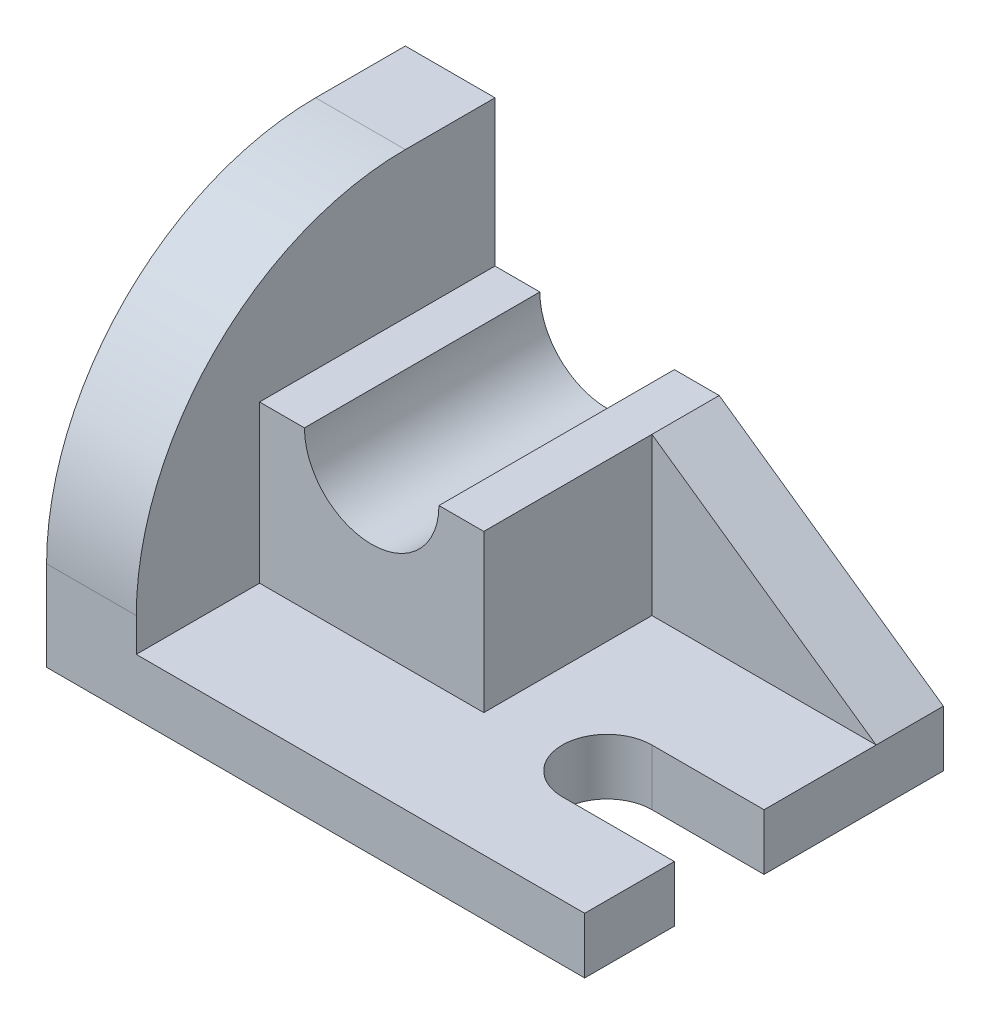
ISO-10303-21;
HEADER;
FILE_DESCRIPTION(('STEP AP214'),'2;1');
FILE_NAME('part.step','',(''),(''),'','','');
FILE_SCHEMA(('AUTOMOTIVE_DESIGN { 1 0 10303 214 1 1 1 1 }'));
ENDSEC;
DATA;
#1=APPLICATION_CONTEXT('core data for automotive mechanical design processes');
#2=APPLICATION_PROTOCOL_DEFINITION('international standard','automotive_design',2000,#1);
#3=PRODUCT_CONTEXT('',#1,'mechanical');
#4=PRODUCT('Part','Part','',(#3));
#5=PRODUCT_RELATED_PRODUCT_CATEGORY('part','',(#4));
#6=PRODUCT_DEFINITION_FORMATION('','',#4);
#7=PRODUCT_DEFINITION_CONTEXT('part definition',#1,'design');
#8=PRODUCT_DEFINITION('design','',#6,#7);
#9=PRODUCT_DEFINITION_SHAPE('','',#8);
#10=(LENGTH_UNIT() NAMED_UNIT(*) SI_UNIT(.MILLI.,.METRE.));
#11=(NAMED_UNIT(*) PLANE_ANGLE_UNIT() SI_UNIT($,.RADIAN.));
#12=(NAMED_UNIT(*) SI_UNIT($,.STERADIAN.) SOLID_ANGLE_UNIT());
#13=UNCERTAINTY_MEASURE_WITH_UNIT(LENGTH_MEASURE(1.E-05),#10,'distance_accuracy_value','');
#14=(GEOMETRIC_REPRESENTATION_CONTEXT(3) GLOBAL_UNCERTAINTY_ASSIGNED_CONTEXT((#13)) GLOBAL_UNIT_ASSIGNED_CONTEXT((#10,
#11,#12)) REPRESENTATION_CONTEXT('',''));
#15=CARTESIAN_POINT('',(0.,0.,0.));
#16=DIRECTION('',(0.,0.,1.));
#17=DIRECTION('',(1.,0.,0.));
#18=AXIS2_PLACEMENT_3D('',#15,#16,#17);
#19=CARTESIAN_POINT('',(0.,10.,0.));
#20=DIRECTION('',(0.,-1.,0.));
#21=DIRECTION('',(0.,0.,-1.));
#22=AXIS2_PLACEMENT_3D('',#19,#20,#21);
#23=PLANE('',#22);
#24=DIRECTION('',(-1.,0.,0.));
#25=VECTOR('',#24,1.);
#26=CARTESIAN_POINT('',(56.,10.,-52.));
#27=LINE('',#26,#25);
#28=CARTESIAN_POINT('',(96.,10.,-52.));
#29=VERTEX_POINT('',#28);
#30=CARTESIAN_POINT('',(56.,10.,-52.));
#31=VERTEX_POINT('',#30);
#32=EDGE_CURVE('E165',#29,#31,#27,.T.);
#33=ORIENTED_EDGE('',*,*,#32,.T.);
#34=DIRECTION('',(0.,0.,1.));
#35=VECTOR('',#34,1.);
#36=CARTESIAN_POINT('',(56.,10.,-64.));
#37=LINE('',#36,#35);
#38=CARTESIAN_POINT('',(56.,10.,-22.));
#39=VERTEX_POINT('',#38);
#40=EDGE_CURVE('E176',#31,#39,#37,.T.);
#41=ORIENTED_EDGE('',*,*,#40,.T.);
#42=DIRECTION('',(1.,0.,0.));
#43=VECTOR('',#42,1.);
#44=CARTESIAN_POINT('',(16.,10.,-22.));
#45=LINE('',#44,#43);
#46=CARTESIAN_POINT('',(16.,10.,-22.));
#47=VERTEX_POINT('',#46);
#48=EDGE_CURVE('E190',#47,#39,#45,.T.);
#49=ORIENTED_EDGE('',*,*,#48,.F.);
#50=DIRECTION('',(0.,0.,1.));
#51=VECTOR('',#50,1.);
#52=CARTESIAN_POINT('',(16.,10.,0.));
#53=LINE('',#52,#51);
#54=CARTESIAN_POINT('',(16.,10.,0.));
#55=VERTEX_POINT('',#54);
#56=EDGE_CURVE('E240',#47,#55,#53,.T.);
#57=ORIENTED_EDGE('',*,*,#56,.T.);
#58=DIRECTION('',(1.,0.,0.));
#59=VECTOR('',#58,1.);
#60=CARTESIAN_POINT('',(0.,10.,0.));
#61=LINE('',#60,#59);
#62=CARTESIAN_POINT('',(96.,10.,0.));
#63=VERTEX_POINT('',#62);
#64=EDGE_CURVE('E268',#55,#63,#61,.T.);
#65=ORIENTED_EDGE('',*,*,#64,.T.);
#66=DIRECTION('',(0.,0.,-1.));
#67=VECTOR('',#66,1.);
#68=CARTESIAN_POINT('',(96.,10.,0.));
#69=LINE('',#68,#67);
#70=CARTESIAN_POINT('',(96.,10.,-16.));
#71=VERTEX_POINT('',#70);
#72=EDGE_CURVE('E272',#63,#71,#69,.T.);
#73=ORIENTED_EDGE('',*,*,#72,.T.);
#74=DIRECTION('',(1.,0.,0.));
#75=VECTOR('',#74,1.);
#76=CARTESIAN_POINT('',(96.,10.,-16.));
#77=LINE('',#76,#75);
#78=CARTESIAN_POINT('',(76.,10.,-16.));
#79=VERTEX_POINT('',#78);
#80=EDGE_CURVE('E251',#79,#71,#77,.T.);
#81=ORIENTED_EDGE('',*,*,#80,.F.);
#82=CARTESIAN_POINT('',(76.,10.,-24.));
#83=DIRECTION('',(0.,1.,0.));
#84=DIRECTION('',(0.,0.,1.));
#85=AXIS2_PLACEMENT_3D('',#82,#83,#84);
#86=CIRCLE('',#85,8.);
#87=CARTESIAN_POINT('',(76.,10.,-32.));
#88=VERTEX_POINT('',#87);
#89=EDGE_CURVE('E247',#88,#79,#86,.T.);
#90=ORIENTED_EDGE('',*,*,#89,.F.);
#91=DIRECTION('',(-1.,0.,0.));
#92=VECTOR('',#91,1.);
#93=CARTESIAN_POINT('',(96.,10.,-32.));
#94=LINE('',#93,#92);
#95=CARTESIAN_POINT('',(96.,10.,-32.));
#96=VERTEX_POINT('',#95);
#97=EDGE_CURVE('E243',#96,#88,#94,.T.);
#98=ORIENTED_EDGE('',*,*,#97,.F.);
#99=EDGE_CURVE('E180',#96,#29,#69,.T.);
#100=ORIENTED_EDGE('',*,*,#99,.T.);
#101=EDGE_LOOP('',(#33,#41,#49,#57,#65,#73,#81,#90,#98,#100));
#102=FACE_BOUND('',#101,.T.);
#103=ADVANCED_FACE('F43',(#102),#23,.F.);
#104=CARTESIAN_POINT('',(56.,38.,-64.));
#105=DIRECTION('',(1.,0.,0.));
#106=DIRECTION('',(0.,0.,-1.));
#107=AXIS2_PLACEMENT_3D('',#104,#105,#106);
#108=PLANE('',#107);
#109=ORIENTED_EDGE('',*,*,#40,.F.);
#110=DIRECTION('',(0.,1.,0.));
#111=VECTOR('',#110,1.);
#112=CARTESIAN_POINT('',(56.,38.,-52.));
#113=LINE('',#112,#111);
#114=CARTESIAN_POINT('',(56.,38.,-52.));
#115=VERTEX_POINT('',#114);
#116=EDGE_CURVE('E162',#31,#115,#113,.T.);
#117=ORIENTED_EDGE('',*,*,#116,.T.);
#118=DIRECTION('',(0.,0.,1.));
#119=VECTOR('',#118,1.);
#120=CARTESIAN_POINT('',(56.,38.,-64.));
#121=LINE('',#120,#119);
#122=CARTESIAN_POINT('',(56.,38.,-22.));
#123=VERTEX_POINT('',#122);
#124=EDGE_CURVE('E339',#115,#123,#121,.T.);
#125=ORIENTED_EDGE('',*,*,#124,.T.);
#126=DIRECTION('',(0.,-1.,0.));
#127=VECTOR('',#126,1.);
#128=CARTESIAN_POINT('',(56.,38.,-22.));
#129=LINE('',#128,#127);
#130=EDGE_CURVE('E186',#123,#39,#129,.T.);
#131=ORIENTED_EDGE('',*,*,#130,.T.);
#132=EDGE_LOOP('',(#109,#117,#125,#131));
#133=FACE_BOUND('',#132,.T.);
#134=ADVANCED_FACE('F184',(#133),#108,.T.);
#135=CARTESIAN_POINT('',(0.,38.,0.));
#136=DIRECTION('',(0.,-1.,0.));
#137=DIRECTION('',(0.,0.,-1.));
#138=AXIS2_PLACEMENT_3D('',#135,#136,#137);
#139=PLANE('',#138);
#140=DIRECTION('',(1.,0.,0.));
#141=VECTOR('',#140,1.);
#142=CARTESIAN_POINT('',(16.,38.,-64.));
#143=LINE('',#142,#141);
#144=CARTESIAN_POINT('',(48.,38.,-64.));
#145=VERTEX_POINT('',#144);
#146=CARTESIAN_POINT('',(56.,38.,-64.));
#147=VERTEX_POINT('',#146);
#148=EDGE_CURVE('E333',#145,#147,#143,.T.);
#149=ORIENTED_EDGE('',*,*,#148,.F.);
#150=DIRECTION('',(0.,0.,1.));
#151=VECTOR('',#150,1.);
#152=CARTESIAN_POINT('',(48.,38.,-64.001));
#153=LINE('',#152,#151);
#154=CARTESIAN_POINT('',(48.,38.,-22.));
#155=VERTEX_POINT('',#154);
#156=EDGE_CURVE('E350',#155,#145,#153,.F.);
#157=ORIENTED_EDGE('',*,*,#156,.F.);
#158=DIRECTION('',(1.,0.,0.));
#159=VECTOR('',#158,1.);
#160=CARTESIAN_POINT('',(16.,38.,-22.));
#161=LINE('',#160,#159);
#162=EDGE_CURVE('E189',#155,#123,#161,.T.);
#163=ORIENTED_EDGE('',*,*,#162,.T.);
#164=ORIENTED_EDGE('',*,*,#124,.F.);
#165=EDGE_CURVE('E337',#147,#115,#121,.T.);
#166=ORIENTED_EDGE('',*,*,#165,.F.);
#167=EDGE_LOOP('',(#149,#157,#163,#164,#166));
#168=FACE_BOUND('',#167,.T.);
#169=ADVANCED_FACE('F367',(#168),#139,.F.);
#170=CARTESIAN_POINT('',(16.,16.,-48.));
#171=DIRECTION('',(1.,0.,0.));
#172=DIRECTION('',(0.,0.,-1.));
#173=AXIS2_PLACEMENT_3D('',#170,#171,#172);
#174=PLANE('',#173);
#175=ORIENTED_EDGE('',*,*,#56,.F.);
#176=DIRECTION('',(0.,-1.,0.));
#177=VECTOR('',#176,1.);
#178=CARTESIAN_POINT('',(16.,38.,-22.));
#179=LINE('',#178,#177);
#180=CARTESIAN_POINT('',(16.,38.,-22.));
#181=VERTEX_POINT('',#180);
#182=EDGE_CURVE('E200',#181,#47,#179,.T.);
#183=ORIENTED_EDGE('',*,*,#182,.F.);
#184=DIRECTION('',(0.,0.,1.));
#185=VECTOR('',#184,1.);
#186=CARTESIAN_POINT('',(16.,38.,-64.));
#187=LINE('',#186,#185);
#188=CARTESIAN_POINT('',(16.,38.,-64.));
#189=VERTEX_POINT('',#188);
#190=EDGE_CURVE('E203',#189,#181,#187,.T.);
#191=ORIENTED_EDGE('',*,*,#190,.F.);
#192=DIRECTION('',(0.,1.,0.));
#193=VECTOR('',#192,1.);
#194=CARTESIAN_POINT('',(16.,0.,-64.));
#195=LINE('',#194,#193);
#196=CARTESIAN_POINT('',(16.,64.,-64.));
#197=VERTEX_POINT('',#196);
#198=EDGE_CURVE('E219',#189,#197,#195,.T.);
#199=ORIENTED_EDGE('',*,*,#198,.T.);
#200=DIRECTION('',(0.,0.,1.));
#201=VECTOR('',#200,1.);
#202=CARTESIAN_POINT('',(16.,64.,-64.));
#203=LINE('',#202,#201);
#204=CARTESIAN_POINT('',(16.,64.,-48.0000000000003));
#205=VERTEX_POINT('',#204);
#206=EDGE_CURVE('E207',#197,#205,#203,.T.);
#207=ORIENTED_EDGE('',*,*,#206,.T.);
#208=CARTESIAN_POINT('',(16.,16.,-48.));
#209=DIRECTION('',(1.,0.,0.));
#210=DIRECTION('',(0.,0.,-1.));
#211=AXIS2_PLACEMENT_3D('',#208,#209,#210);
#212=CIRCLE('',#211,48.);
#213=CARTESIAN_POINT('',(16.,15.9999999999997,0.));
#214=VERTEX_POINT('',#213);
#215=EDGE_CURVE('E211',#205,#214,#212,.T.);
#216=ORIENTED_EDGE('',*,*,#215,.T.);
#217=DIRECTION('',(0.,1.,0.));
#218=VECTOR('',#217,1.);
#219=CARTESIAN_POINT('',(16.,0.,0.));
#220=LINE('',#219,#218);
#221=EDGE_CURVE('E216',#55,#214,#220,.T.);
#222=ORIENTED_EDGE('',*,*,#221,.F.);
#223=EDGE_LOOP('',(#175,#183,#191,#199,#207,#216,#222));
#224=FACE_BOUND('',#223,.T.);
#225=ADVANCED_FACE('F378',(#224),#174,.T.);
#226=CARTESIAN_POINT('',(96.,10.,0.));
#227=DIRECTION('',(-1.,0.,0.));
#228=DIRECTION('',(0.,0.,1.));
#229=AXIS2_PLACEMENT_3D('',#226,#227,#228);
#230=PLANE('',#229);
#231=DIRECTION('',(0.,0.,-1.));
#232=VECTOR('',#231,1.);
#233=CARTESIAN_POINT('',(96.,0.,0.));
#234=LINE('',#233,#232);
#235=CARTESIAN_POINT('',(96.,0.,0.));
#236=VERTEX_POINT('',#235);
#237=CARTESIAN_POINT('',(96.,0.,-16.));
#238=VERTEX_POINT('',#237);
#239=EDGE_CURVE('E284',#236,#238,#234,.T.);
#240=ORIENTED_EDGE('',*,*,#239,.T.);
#241=DIRECTION('',(0.,1.,0.));
#242=VECTOR('',#241,1.);
#243=CARTESIAN_POINT('',(96.,-3.,-16.));
#244=LINE('',#243,#242);
#245=EDGE_CURVE('E255',#238,#71,#244,.T.);
#246=ORIENTED_EDGE('',*,*,#245,.T.);
#247=ORIENTED_EDGE('',*,*,#72,.F.);
#248=DIRECTION('',(0.,-1.,0.));
#249=VECTOR('',#248,1.);
#250=CARTESIAN_POINT('',(96.,10.,0.));
#251=LINE('',#250,#249);
#252=EDGE_CURVE('E297',#63,#236,#251,.T.);
#253=ORIENTED_EDGE('',*,*,#252,.T.);
#254=EDGE_LOOP('',(#240,#246,#247,#253));
#255=FACE_BOUND('',#254,.T.);
#256=ADVANCED_FACE('F387',(#255),#230,.F.);
#257=CARTESIAN_POINT('',(0.,10.,0.));
#258=DIRECTION('',(1.,0.,0.));
#259=DIRECTION('',(0.,0.,-1.));
#260=AXIS2_PLACEMENT_3D('',#257,#258,#259);
#261=PLANE('',#260);
#262=DIRECTION('',(0.,0.,1.));
#263=VECTOR('',#262,1.);
#264=CARTESIAN_POINT('',(0.,0.,0.));
#265=LINE('',#264,#263);
#266=CARTESIAN_POINT('',(0.,0.,-64.));
#267=VERTEX_POINT('',#266);
#268=CARTESIAN_POINT('',(0.,0.,0.));
#269=VERTEX_POINT('',#268);
#270=EDGE_CURVE('E259',#267,#269,#265,.T.);
#271=ORIENTED_EDGE('',*,*,#270,.T.);
#272=DIRECTION('',(0.,-1.,0.));
#273=VECTOR('',#272,1.);
#274=CARTESIAN_POINT('',(0.,10.,0.));
#275=LINE('',#274,#273);
#276=CARTESIAN_POINT('',(0.,15.9999999999997,0.));
#277=VERTEX_POINT('',#276);
#278=EDGE_CURVE('E301',#277,#269,#275,.T.);
#279=ORIENTED_EDGE('',*,*,#278,.F.);
#280=CARTESIAN_POINT('',(0.,16.,-48.));
#281=DIRECTION('',(1.,0.,0.));
#282=DIRECTION('',(0.,0.,-1.));
#283=AXIS2_PLACEMENT_3D('',#280,#281,#282);
#284=CIRCLE('',#283,48.);
#285=CARTESIAN_POINT('',(0.,64.,-48.0000000000003));
#286=VERTEX_POINT('',#285);
#287=EDGE_CURVE('E212',#286,#277,#284,.T.);
#288=ORIENTED_EDGE('',*,*,#287,.F.);
#289=DIRECTION('',(0.,0.,1.));
#290=VECTOR('',#289,1.);
#291=CARTESIAN_POINT('',(0.,64.,-64.));
#292=LINE('',#291,#290);
#293=CARTESIAN_POINT('',(0.,64.,-64.));
#294=VERTEX_POINT('',#293);
#295=EDGE_CURVE('E206',#294,#286,#292,.T.);
#296=ORIENTED_EDGE('',*,*,#295,.F.);
#297=DIRECTION('',(0.,-1.,0.));
#298=VECTOR('',#297,1.);
#299=CARTESIAN_POINT('',(0.,10.,-64.));
#300=LINE('',#299,#298);
#301=EDGE_CURVE('E276',#294,#267,#300,.T.);
#302=ORIENTED_EDGE('',*,*,#301,.T.);
#303=EDGE_LOOP('',(#271,#279,#288,#296,#302));
#304=FACE_BOUND('',#303,.T.);
#305=ADVANCED_FACE('F45',(#304),#261,.F.);
#306=CARTESIAN_POINT('',(0.,10.,0.));
#307=DIRECTION('',(0.,0.,-1.));
#308=DIRECTION('',(-1.,0.,0.));
#309=AXIS2_PLACEMENT_3D('',#306,#307,#308);
#310=PLANE('',#309);
#311=ORIENTED_EDGE('',*,*,#64,.F.);
#312=ORIENTED_EDGE('',*,*,#221,.T.);
#313=DIRECTION('',(-1.,0.,0.));
#314=VECTOR('',#313,1.);
#315=CARTESIAN_POINT('',(16.,15.9999999999997,0.));
#316=LINE('',#315,#314);
#317=EDGE_CURVE('E232',#214,#277,#316,.T.);
#318=ORIENTED_EDGE('',*,*,#317,.T.);
#319=ORIENTED_EDGE('',*,*,#278,.T.);
#320=DIRECTION('',(1.,0.,0.));
#321=VECTOR('',#320,1.);
#322=CARTESIAN_POINT('',(0.,0.,0.));
#323=LINE('',#322,#321);
#324=EDGE_CURVE('E280',#269,#236,#323,.T.);
#325=ORIENTED_EDGE('',*,*,#324,.T.);
#326=ORIENTED_EDGE('',*,*,#252,.F.);
#327=EDGE_LOOP('',(#311,#312,#318,#319,#325,#326));
#328=FACE_BOUND('',#327,.T.);
#329=ADVANCED_FACE('F381',(#328),#310,.F.);
#330=ORIENTED_EDGE('',*,*,#99,.F.);
#331=DIRECTION('',(0.,1.,0.));
#332=VECTOR('',#331,1.);
#333=CARTESIAN_POINT('',(96.,-3.,-32.));
#334=LINE('',#333,#332);
#335=CARTESIAN_POINT('',(96.,0.,-32.));
#336=VERTEX_POINT('',#335);
#337=EDGE_CURVE('E254',#336,#96,#334,.T.);
#338=ORIENTED_EDGE('',*,*,#337,.F.);
#339=CARTESIAN_POINT('',(96.,0.,-64.));
#340=VERTEX_POINT('',#339);
#341=EDGE_CURVE('E283',#336,#340,#234,.T.);
#342=ORIENTED_EDGE('',*,*,#341,.T.);
#343=DIRECTION('',(0.,-1.,0.));
#344=VECTOR('',#343,1.);
#345=CARTESIAN_POINT('',(96.,10.,-64.));
#346=LINE('',#345,#344);
#347=CARTESIAN_POINT('',(96.,10.,-64.));
#348=VERTEX_POINT('',#347);
#349=EDGE_CURVE('E293',#348,#340,#346,.T.);
#350=ORIENTED_EDGE('',*,*,#349,.F.);
#351=DIRECTION('',(0.,0.,-1.));
#352=VECTOR('',#351,1.);
#353=CARTESIAN_POINT('',(96.,10.,-52.));
#354=LINE('',#353,#352);
#355=EDGE_CURVE('E327',#29,#348,#354,.T.);
#356=ORIENTED_EDGE('',*,*,#355,.F.);
#357=EDGE_LOOP('',(#330,#338,#342,#350,#356));
#358=FACE_BOUND('',#357,.T.);
#359=ADVANCED_FACE('F324',(#358),#230,.F.);
#360=CARTESIAN_POINT('',(0.,10.,-64.));
#361=DIRECTION('',(0.,0.,1.));
#362=DIRECTION('',(1.,0.,0.));
#363=AXIS2_PLACEMENT_3D('',#360,#361,#362);
#364=PLANE('',#363);
#365=CARTESIAN_POINT('',(24.,38.,-64.));
#366=VERTEX_POINT('',#365);
#367=EDGE_CURVE('E66',#189,#366,#143,.T.);
#368=ORIENTED_EDGE('',*,*,#367,.T.);
#369=CARTESIAN_POINT('',(36.,38.,-64.));
#370=DIRECTION('',(0.,0.,1.));
#371=DIRECTION('',(1.,0.,0.));
#372=AXIS2_PLACEMENT_3D('',#369,#370,#371);
#373=CIRCLE('',#372,12.);
#374=EDGE_CURVE('E59',#145,#366,#373,.F.);
#375=ORIENTED_EDGE('',*,*,#374,.F.);
#376=ORIENTED_EDGE('',*,*,#148,.T.);
#377=DIRECTION('',(0.81923192051904,-0.573462344363328,0.));
#378=VECTOR('',#377,1.);
#379=CARTESIAN_POINT('',(96.,10.,-64.));
#380=LINE('',#379,#378);
#381=EDGE_CURVE('E182',#147,#348,#380,.T.);
#382=ORIENTED_EDGE('',*,*,#381,.T.);
#383=ORIENTED_EDGE('',*,*,#349,.T.);
#384=DIRECTION('',(-1.,0.,0.));
#385=VECTOR('',#384,1.);
#386=CARTESIAN_POINT('',(0.,0.,-64.));
#387=LINE('',#386,#385);
#388=EDGE_CURVE('E271',#340,#267,#387,.T.);
#389=ORIENTED_EDGE('',*,*,#388,.T.);
#390=ORIENTED_EDGE('',*,*,#301,.F.);
#391=DIRECTION('',(-1.,0.,0.));
#392=VECTOR('',#391,1.);
#393=CARTESIAN_POINT('',(16.,64.,-64.));
#394=LINE('',#393,#392);
#395=EDGE_CURVE('E222',#197,#294,#394,.T.);
#396=ORIENTED_EDGE('',*,*,#395,.F.);
#397=ORIENTED_EDGE('',*,*,#198,.F.);
#398=EDGE_LOOP('',(#368,#375,#376,#382,#383,#389,#390,#396,#397));
#399=FACE_BOUND('',#398,.T.);
#400=ADVANCED_FACE('F395',(#399),#364,.F.);
#401=CARTESIAN_POINT('',(0.,0.,0.));
#402=DIRECTION('',(0.,-1.,0.));
#403=DIRECTION('',(0.,0.,-1.));
#404=AXIS2_PLACEMENT_3D('',#401,#402,#403);
#405=PLANE('',#404);
#406=ORIENTED_EDGE('',*,*,#239,.F.);
#407=ORIENTED_EDGE('',*,*,#324,.F.);
#408=ORIENTED_EDGE('',*,*,#270,.F.);
#409=ORIENTED_EDGE('',*,*,#388,.F.);
#410=ORIENTED_EDGE('',*,*,#341,.F.);
#411=DIRECTION('',(1.,0.,0.));
#412=VECTOR('',#411,1.);
#413=CARTESIAN_POINT('',(0.,0.,-32.));
#414=LINE('',#413,#412);
#415=CARTESIAN_POINT('',(76.,0.,-32.));
#416=VERTEX_POINT('',#415);
#417=EDGE_CURVE('E305',#416,#336,#414,.T.);
#418=ORIENTED_EDGE('',*,*,#417,.F.);
#419=CARTESIAN_POINT('',(76.,0.,-24.));
#420=DIRECTION('',(0.,-1.,0.));
#421=DIRECTION('',(0.,0.,-1.));
#422=AXIS2_PLACEMENT_3D('',#419,#420,#421);
#423=CIRCLE('',#422,8.);
#424=CARTESIAN_POINT('',(76.,0.,-16.));
#425=VERTEX_POINT('',#424);
#426=EDGE_CURVE('E52',#425,#416,#423,.T.);
#427=ORIENTED_EDGE('',*,*,#426,.F.);
#428=DIRECTION('',(-1.,0.,0.));
#429=VECTOR('',#428,1.);
#430=CARTESIAN_POINT('',(0.,0.,-16.));
#431=LINE('',#430,#429);
#432=EDGE_CURVE('E11',#238,#425,#431,.T.);
#433=ORIENTED_EDGE('',*,*,#432,.F.);
#434=EDGE_LOOP('',(#406,#407,#408,#409,#410,#418,#427,#433));
#435=FACE_BOUND('',#434,.T.);
#436=ADVANCED_FACE('F318',(#435),#405,.T.);
#437=CARTESIAN_POINT('',(96.,-3.,-16.));
#438=DIRECTION('',(0.,0.,1.));
#439=DIRECTION('',(1.,0.,0.));
#440=AXIS2_PLACEMENT_3D('',#437,#438,#439);
#441=PLANE('',#440);
#442=ORIENTED_EDGE('',*,*,#432,.T.);
#443=DIRECTION('',(0.,1.,0.));
#444=VECTOR('',#443,1.);
#445=CARTESIAN_POINT('',(76.,-3.,-16.));
#446=LINE('',#445,#444);
#447=EDGE_CURVE('E260',#425,#79,#446,.T.);
#448=ORIENTED_EDGE('',*,*,#447,.T.);
#449=ORIENTED_EDGE('',*,*,#80,.T.);
#450=ORIENTED_EDGE('',*,*,#245,.F.);
#451=EDGE_LOOP('',(#442,#448,#449,#450));
#452=FACE_BOUND('',#451,.T.);
#453=ADVANCED_FACE('F389',(#452),#441,.F.);
#454=CARTESIAN_POINT('',(76.,-3.,-24.));
#455=DIRECTION('',(0.,1.,0.));
#456=DIRECTION('',(0.,0.,1.));
#457=AXIS2_PLACEMENT_3D('',#454,#455,#456);
#458=CYLINDRICAL_SURFACE('',#457,8.);
#459=ORIENTED_EDGE('',*,*,#426,.T.);
#460=DIRECTION('',(0.,1.,0.));
#461=VECTOR('',#460,1.);
#462=CARTESIAN_POINT('',(76.,-3.,-32.));
#463=LINE('',#462,#461);
#464=EDGE_CURVE('E263',#416,#88,#463,.T.);
#465=ORIENTED_EDGE('',*,*,#464,.T.);
#466=ORIENTED_EDGE('',*,*,#89,.T.);
#467=ORIENTED_EDGE('',*,*,#447,.F.);
#468=EDGE_LOOP('',(#459,#465,#466,#467));
#469=FACE_BOUND('',#468,.T.);
#470=ADVANCED_FACE('F313',(#469),#458,.F.);
#471=CARTESIAN_POINT('',(96.,-3.,-32.));
#472=DIRECTION('',(0.,0.,-1.));
#473=DIRECTION('',(-1.,0.,0.));
#474=AXIS2_PLACEMENT_3D('',#471,#472,#473);
#475=PLANE('',#474);
#476=ORIENTED_EDGE('',*,*,#417,.T.);
#477=ORIENTED_EDGE('',*,*,#337,.T.);
#478=ORIENTED_EDGE('',*,*,#97,.T.);
#479=ORIENTED_EDGE('',*,*,#464,.F.);
#480=EDGE_LOOP('',(#476,#477,#478,#479));
#481=FACE_BOUND('',#480,.T.);
#482=ADVANCED_FACE('F322',(#481),#475,.F.);
#483=CARTESIAN_POINT('',(16.,64.,-64.));
#484=DIRECTION('',(0.,-1.,0.));
#485=DIRECTION('',(0.,0.,-1.));
#486=AXIS2_PLACEMENT_3D('',#483,#484,#485);
#487=PLANE('',#486);
#488=ORIENTED_EDGE('',*,*,#295,.T.);
#489=DIRECTION('',(-1.,0.,0.));
#490=VECTOR('',#489,1.);
#491=CARTESIAN_POINT('',(16.,64.,-48.0000000000003));
#492=LINE('',#491,#490);
#493=EDGE_CURVE('E236',#205,#286,#492,.T.);
#494=ORIENTED_EDGE('',*,*,#493,.F.);
#495=ORIENTED_EDGE('',*,*,#206,.F.);
#496=ORIENTED_EDGE('',*,*,#395,.T.);
#497=EDGE_LOOP('',(#488,#494,#495,#496));
#498=FACE_BOUND('',#497,.T.);
#499=ADVANCED_FACE('F399',(#498),#487,.F.);
#500=CARTESIAN_POINT('',(16.,16.,-48.));
#501=DIRECTION('',(-1.,0.,0.));
#502=DIRECTION('',(0.,0.,1.));
#503=AXIS2_PLACEMENT_3D('',#500,#501,#502);
#504=CYLINDRICAL_SURFACE('',#503,48.);
#505=ORIENTED_EDGE('',*,*,#287,.T.);
#506=ORIENTED_EDGE('',*,*,#317,.F.);
#507=ORIENTED_EDGE('',*,*,#215,.F.);
#508=ORIENTED_EDGE('',*,*,#493,.T.);
#509=EDGE_LOOP('',(#505,#506,#507,#508));
#510=FACE_BOUND('',#509,.T.);
#511=ADVANCED_FACE('F441',(#510),#504,.T.);
#512=CARTESIAN_POINT('',(16.,38.,-22.));
#513=DIRECTION('',(0.,0.,-1.));
#514=DIRECTION('',(-1.,0.,0.));
#515=AXIS2_PLACEMENT_3D('',#512,#513,#514);
#516=PLANE('',#515);
#517=ORIENTED_EDGE('',*,*,#162,.F.);
#518=CARTESIAN_POINT('',(36.,38.,-22.));
#519=DIRECTION('',(0.,0.,1.));
#520=DIRECTION('',(1.,0.,0.));
#521=AXIS2_PLACEMENT_3D('',#518,#519,#520);
#522=CIRCLE('',#521,12.);
#523=CARTESIAN_POINT('',(24.,38.,-22.));
#524=VERTEX_POINT('',#523);
#525=EDGE_CURVE('E347',#524,#155,#522,.T.);
#526=ORIENTED_EDGE('',*,*,#525,.F.);
#527=EDGE_CURVE('E195',#181,#524,#161,.T.);
#528=ORIENTED_EDGE('',*,*,#527,.F.);
#529=ORIENTED_EDGE('',*,*,#182,.T.);
#530=ORIENTED_EDGE('',*,*,#48,.T.);
#531=ORIENTED_EDGE('',*,*,#130,.F.);
#532=EDGE_LOOP('',(#517,#526,#528,#529,#530,#531));
#533=FACE_BOUND('',#532,.T.);
#534=ADVANCED_FACE('F372',(#533),#516,.F.);
#535=ORIENTED_EDGE('',*,*,#527,.T.);
#536=DIRECTION('',(0.,0.,1.));
#537=VECTOR('',#536,1.);
#538=CARTESIAN_POINT('',(24.,38.,-64.001));
#539=LINE('',#538,#537);
#540=EDGE_CURVE('E353',#366,#524,#539,.T.);
#541=ORIENTED_EDGE('',*,*,#540,.F.);
#542=ORIENTED_EDGE('',*,*,#367,.F.);
#543=ORIENTED_EDGE('',*,*,#190,.T.);
#544=EDGE_LOOP('',(#535,#541,#542,#543));
#545=FACE_BOUND('',#544,.T.);
#546=ADVANCED_FACE('F401',(#545),#139,.F.);
#547=CARTESIAN_POINT('',(36.,38.,-64.001));
#548=DIRECTION('',(0.,0.,1.));
#549=DIRECTION('',(1.,0.,0.));
#550=AXIS2_PLACEMENT_3D('',#547,#548,#549);
#551=CYLINDRICAL_SURFACE('',#550,12.);
#552=ORIENTED_EDGE('',*,*,#156,.T.);
#553=ORIENTED_EDGE('',*,*,#374,.T.);
#554=ORIENTED_EDGE('',*,*,#540,.T.);
#555=ORIENTED_EDGE('',*,*,#525,.T.);
#556=EDGE_LOOP('',(#552,#553,#554,#555));
#557=FACE_BOUND('',#556,.T.);
#558=ADVANCED_FACE('F402',(#557),#551,.F.);
#559=CARTESIAN_POINT('',(96.,10.,-52.));
#560=DIRECTION('',(0.573462344363328,0.81923192051904,0.));
#561=DIRECTION('',(-0.81923192051904,0.573462344363328,0.));
#562=AXIS2_PLACEMENT_3D('',#559,#560,#561);
#563=PLANE('',#562);
#564=ORIENTED_EDGE('',*,*,#381,.F.);
#565=ORIENTED_EDGE('',*,*,#165,.T.);
#566=DIRECTION('',(0.81923192051904,-0.573462344363328,0.));
#567=VECTOR('',#566,1.);
#568=CARTESIAN_POINT('',(96.,10.,-52.));
#569=LINE('',#568,#567);
#570=EDGE_CURVE('E167',#115,#29,#569,.T.);
#571=ORIENTED_EDGE('',*,*,#570,.T.);
#572=ORIENTED_EDGE('',*,*,#355,.T.);
#573=EDGE_LOOP('',(#564,#565,#571,#572));
#574=FACE_BOUND('',#573,.T.);
#575=ADVANCED_FACE('F363',(#574),#563,.T.);
#576=CARTESIAN_POINT('',(0.,0.,-52.));
#577=DIRECTION('',(0.,0.,-1.));
#578=DIRECTION('',(-1.,0.,0.));
#579=AXIS2_PLACEMENT_3D('',#576,#577,#578);
#580=PLANE('',#579);
#581=ORIENTED_EDGE('',*,*,#32,.F.);
#582=ORIENTED_EDGE('',*,*,#570,.F.);
#583=ORIENTED_EDGE('',*,*,#116,.F.);
#584=EDGE_LOOP('',(#581,#582,#583));
#585=FACE_BOUND('',#584,.T.);
#586=ADVANCED_FACE('F164',(#585),#580,.F.);
#587=CLOSED_SHELL('',(#103,#134,#169,#225,#256,#305,#329,#359,#400,#436,#453,#470,#482,#499,
#511,#534,#546,#558,#575,#586));
#588=MANIFOLD_SOLID_BREP('B2',#587);
#589=ADVANCED_BREP_SHAPE_REPRESENTATION('',(#18,#588),#14);
#590=SHAPE_DEFINITION_REPRESENTATION(#9,#589);
ENDSEC;
END-ISO-10303-21;
